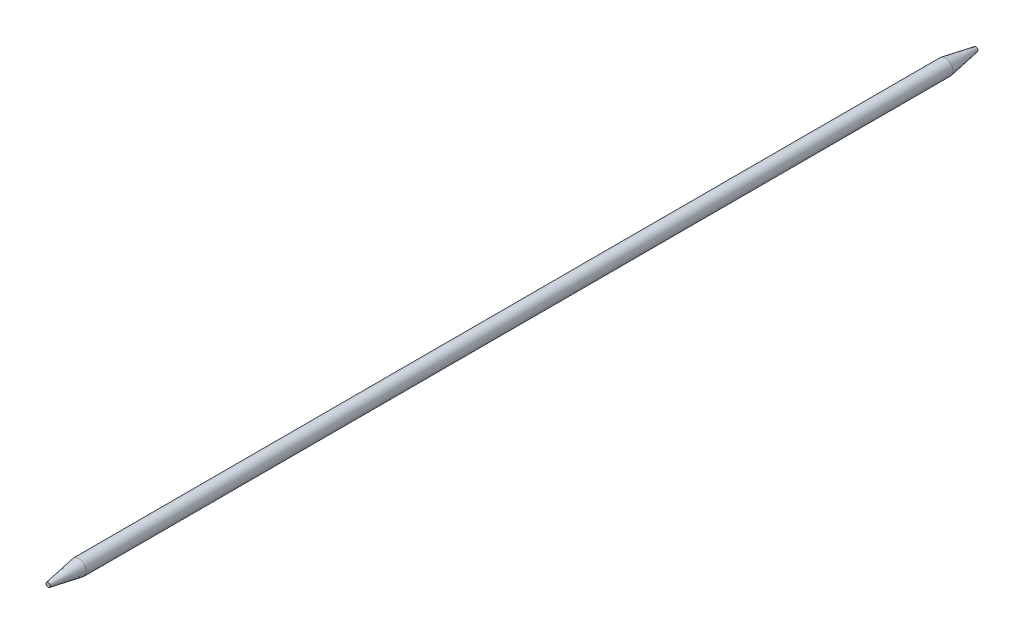
ISO-10303-21;
HEADER;
FILE_DESCRIPTION(('STEP AP214'),'2;1');
FILE_NAME('part.step','',(''),(''),'','','');
FILE_SCHEMA(('AUTOMOTIVE_DESIGN { 1 0 10303 214 1 1 1 1 }'));
ENDSEC;
DATA;
#1=APPLICATION_CONTEXT('core data for automotive mechanical design processes');
#2=APPLICATION_PROTOCOL_DEFINITION('international standard','automotive_design',2000,#1);
#3=PRODUCT_CONTEXT('',#1,'mechanical');
#4=PRODUCT('Part','Part','',(#3));
#5=PRODUCT_RELATED_PRODUCT_CATEGORY('part','',(#4));
#6=PRODUCT_DEFINITION_FORMATION('','',#4);
#7=PRODUCT_DEFINITION_CONTEXT('part definition',#1,'design');
#8=PRODUCT_DEFINITION('design','',#6,#7);
#9=PRODUCT_DEFINITION_SHAPE('','',#8);
#10=(LENGTH_UNIT() NAMED_UNIT(*) SI_UNIT(.MILLI.,.METRE.));
#11=(NAMED_UNIT(*) PLANE_ANGLE_UNIT() SI_UNIT($,.RADIAN.));
#12=(NAMED_UNIT(*) SI_UNIT($,.STERADIAN.) SOLID_ANGLE_UNIT());
#13=UNCERTAINTY_MEASURE_WITH_UNIT(LENGTH_MEASURE(1.E-05),#10,'distance_accuracy_value','');
#14=(GEOMETRIC_REPRESENTATION_CONTEXT(3) GLOBAL_UNCERTAINTY_ASSIGNED_CONTEXT((#13)) GLOBAL_UNIT_ASSIGNED_CONTEXT((#10,
#11,#12)) REPRESENTATION_CONTEXT('',''));
#15=CARTESIAN_POINT('',(0.,0.,0.));
#16=DIRECTION('',(0.,0.,1.));
#17=DIRECTION('',(1.,0.,0.));
#18=AXIS2_PLACEMENT_3D('',#15,#16,#17);
#19=CARTESIAN_POINT('',(0.,0.,10972.8));
#20=DIRECTION('',(0.,0.,-1.));
#21=DIRECTION('',(-1.,0.,0.));
#22=AXIS2_PLACEMENT_3D('',#19,#20,#21);
#23=CYLINDRICAL_SURFACE('',#22,88.9);
#24=CARTESIAN_POINT('',(0.,0.,10612.6736044543));
#25=DIRECTION('',(0.,0.,1.));
#26=DIRECTION('',(1.,0.,0.));
#27=AXIS2_PLACEMENT_3D('',#24,#25,#26);
#28=CIRCLE('',#27,88.9);
#29=CARTESIAN_POINT('',(-88.9000000000001,0.,10612.6736044543));
#30=VERTEX_POINT('',#29);
#31=EDGE_CURVE('E10',#30,#30,#28,.F.);
#32=ORIENTED_EDGE('',*,*,#31,.T.);
#33=EDGE_LOOP('',(#32));
#34=FACE_BOUND('',#33,.T.);
#35=CARTESIAN_POINT('',(0.,0.,360.126395545738));
#36=DIRECTION('',(0.,0.,1.));
#37=DIRECTION('',(1.,0.,0.));
#38=AXIS2_PLACEMENT_3D('',#35,#36,#37);
#39=CIRCLE('',#38,88.9);
#40=CARTESIAN_POINT('',(88.9,0.,360.126395545738));
#41=VERTEX_POINT('',#40);
#42=EDGE_CURVE('E46',#41,#41,#39,.T.);
#43=ORIENTED_EDGE('',*,*,#42,.T.);
#44=EDGE_LOOP('',(#43));
#45=FACE_BOUND('',#44,.T.);
#46=ADVANCED_FACE('F31',(#34,#45),#23,.T.);
#47=CARTESIAN_POINT('',(0.,0.,10972.8));
#48=DIRECTION('',(0.,0.,1.));
#49=DIRECTION('',(1.,0.,0.));
#50=AXIS2_PLACEMENT_3D('',#47,#48,#49);
#51=PLANE('',#50);
#52=CARTESIAN_POINT('',(0.,0.,10972.8));
#53=DIRECTION('',(0.,0.,1.));
#54=DIRECTION('',(1.,0.,0.));
#55=AXIS2_PLACEMENT_3D('',#52,#53,#54);
#56=CIRCLE('',#55,25.4000000000048);
#57=CARTESIAN_POINT('',(-25.4000000000049,0.,10972.8));
#58=VERTEX_POINT('',#57);
#59=EDGE_CURVE('E38',#58,#58,#56,.T.);
#60=ORIENTED_EDGE('',*,*,#59,.T.);
#61=EDGE_LOOP('',(#60));
#62=FACE_BOUND('',#61,.T.);
#63=ADVANCED_FACE('F62',(#62),#51,.T.);
#64=CARTESIAN_POINT('',(0.,0.,0.));
#65=DIRECTION('',(0.,0.,1.));
#66=DIRECTION('',(1.,0.,0.));
#67=AXIS2_PLACEMENT_3D('',#64,#65,#66);
#68=PLANE('',#67);
#69=CARTESIAN_POINT('',(0.,0.,0.));
#70=DIRECTION('',(0.,0.,1.));
#71=DIRECTION('',(1.,0.,0.));
#72=AXIS2_PLACEMENT_3D('',#69,#70,#71);
#73=CIRCLE('',#72,25.3999999999977);
#74=CARTESIAN_POINT('',(25.3999999999977,0.,0.));
#75=VERTEX_POINT('',#74);
#76=EDGE_CURVE('E42',#75,#75,#73,.F.);
#77=ORIENTED_EDGE('',*,*,#76,.T.);
#78=EDGE_LOOP('',(#77));
#79=FACE_BOUND('',#78,.T.);
#80=ADVANCED_FACE('F55',(#79),#68,.F.);
#81=CARTESIAN_POINT('',(0.,0.,360.126395545738));
#82=DIRECTION('',(0.,0.,1.));
#83=DIRECTION('',(1.,0.,0.));
#84=AXIS2_PLACEMENT_3D('',#81,#82,#83);
#85=CONICAL_SURFACE('',#84,88.9,0.174532925199433);
#86=CARTESIAN_POINT('',(25.3999999999977,0.,0.));
#87=CARTESIAN_POINT('',(26.061458333331,0.,3.75131662026809));
#88=CARTESIAN_POINT('',(26.7229166666644,0.,7.5026332405362));
#89=CARTESIAN_POINT('',(28.0458333333311,0.,15.0052664810724));
#90=CARTESIAN_POINT('',(28.7072916666644,0.,18.7565831013405));
#91=CARTESIAN_POINT('',(30.0302083333312,0.,26.2592163418767));
#92=CARTESIAN_POINT('',(30.6916666666645,0.,30.0105329621448));
#93=CARTESIAN_POINT('',(32.0145833333312,0.,37.513166202681));
#94=CARTESIAN_POINT('',(32.6760416666646,0.,41.2644828229491));
#95=CARTESIAN_POINT('',(33.9989583333313,0.,48.7671160634853));
#96=CARTESIAN_POINT('',(34.6604166666647,0.,52.5184326837534));
#97=CARTESIAN_POINT('',(35.9833333333314,0.,60.0210659242896));
#98=CARTESIAN_POINT('',(36.6447916666647,0.,63.7723825445577));
#99=CARTESIAN_POINT('',(37.9677083333315,0.,71.2750157850939));
#100=CARTESIAN_POINT('',(38.6291666666648,0.,75.026332405362));
#101=CARTESIAN_POINT('',(39.9520833333315,0.,82.5289656458982));
#102=CARTESIAN_POINT('',(40.6135416666649,0.,86.2802822661663));
#103=CARTESIAN_POINT('',(41.9364583333316,0.,93.7829155067025));
#104=CARTESIAN_POINT('',(42.597916666665,0.,97.5342321269706));
#105=CARTESIAN_POINT('',(43.9208333333317,0.,105.036865367507));
#106=CARTESIAN_POINT('',(44.582291666665,0.,108.788181987775));
#107=CARTESIAN_POINT('',(45.9052083333317,0.,116.290815228311));
#108=CARTESIAN_POINT('',(46.5666666666651,0.,120.042131848579));
#109=CARTESIAN_POINT('',(47.8895833333318,0.,127.544765089115));
#110=CARTESIAN_POINT('',(48.5510416666652,0.,131.296081709384));
#111=CARTESIAN_POINT('',(49.8739583333319,0.,138.79871494992));
#112=CARTESIAN_POINT('',(50.5354166666652,0.,142.550031570188));
#113=CARTESIAN_POINT('',(51.858333333332,0.,150.052664810724));
#114=CARTESIAN_POINT('',(52.5197916666653,0.,153.803981430992));
#115=CARTESIAN_POINT('',(53.842708333332,0.,161.306614671528));
#116=CARTESIAN_POINT('',(54.5041666666654,0.,165.057931291796));
#117=CARTESIAN_POINT('',(55.8270833333321,0.,172.560564532333));
#118=CARTESIAN_POINT('',(56.4885416666655,0.,176.311881152601));
#119=CARTESIAN_POINT('',(57.8114583333322,0.,183.814514393137));
#120=CARTESIAN_POINT('',(58.4729166666655,0.,187.565831013405));
#121=CARTESIAN_POINT('',(59.7958333333323,0.,195.068464253941));
#122=CARTESIAN_POINT('',(60.4572916666656,0.,198.819780874209));
#123=CARTESIAN_POINT('',(61.7802083333323,0.,206.322414114746));
#124=CARTESIAN_POINT('',(62.4416666666657,0.,210.073730735014));
#125=CARTESIAN_POINT('',(63.7645833333324,0.,217.57636397555));
#126=CARTESIAN_POINT('',(64.4260416666658,0.,221.327680595818));
#127=CARTESIAN_POINT('',(65.7489583333325,0.,228.830313836354));
#128=CARTESIAN_POINT('',(66.4104166666658,0.,232.581630456622));
#129=CARTESIAN_POINT('',(67.7333333333326,0.,240.084263697158));
#130=CARTESIAN_POINT('',(68.3947916666659,0.,243.835580317427));
#131=CARTESIAN_POINT('',(69.7177083333326,0.,251.338213557963));
#132=CARTESIAN_POINT('',(70.379166666666,0.,255.089530178231));
#133=CARTESIAN_POINT('',(71.7020833333327,0.,262.592163418767));
#134=CARTESIAN_POINT('',(72.3635416666661,0.,266.343480039035));
#135=CARTESIAN_POINT('',(73.6864583333328,0.,273.846113279571));
#136=CARTESIAN_POINT('',(74.3479166666661,0.,277.597429899839));
#137=CARTESIAN_POINT('',(75.6708333333328,0.,285.100063140376));
#138=CARTESIAN_POINT('',(76.3322916666662,0.,288.851379760644));
#139=CARTESIAN_POINT('',(77.6552083333329,0.,296.35401300118));
#140=CARTESIAN_POINT('',(78.3166666666663,0.,300.105329621448));
#141=CARTESIAN_POINT('',(79.639583333333,0.,307.607962861984));
#142=CARTESIAN_POINT('',(80.3010416666663,0.,311.359279482252));
#143=CARTESIAN_POINT('',(81.6239583333331,0.,318.861912722789));
#144=CARTESIAN_POINT('',(82.2854166666664,0.,322.613229343057));
#145=CARTESIAN_POINT('',(83.6083333333331,0.,330.115862583593));
#146=CARTESIAN_POINT('',(84.2697916666665,0.,333.867179203861));
#147=CARTESIAN_POINT('',(85.5927083333332,0.,341.369812444397));
#148=CARTESIAN_POINT('',(86.2541666666666,0.,345.121129064665));
#149=CARTESIAN_POINT('',(87.5770833333333,0.,352.623762305201));
#150=CARTESIAN_POINT('',(88.2385416666666,0.,356.37507892547));
#151=CARTESIAN_POINT('',(88.9,0.,360.126395545738));
#152=B_SPLINE_CURVE_WITH_KNOTS('',3,(#86,#87,#88,#89,#90,#91,#92,#93,#94,#95,#96,#97,#98,#99,
#100,#101,#102,#103,#104,#105,#106,#107,#108,#109,#110,#111,#112,#113,#114,#115,#116,#117,#118,
#119,#120,#121,#122,#123,#124,#125,#126,#127,#128,#129,#130,#131,#132,#133,#134,#135,#136,#137,
#138,#139,#140,#141,#142,#143,#144,#145,#146,#147,#148,#149,#150,#151),.UNSPECIFIED.,.F.,.F.,(4,
2,2,2,2,2,2,2,2,2,2,2,2,2,2,2,2,2,2,2,2,2,2,2,2,2,2,2,2,2,2,2,4),(0.,11.4275601774886,
22.8551203549771,34.2826805324657,45.7102407099543,57.1378008874428,68.5653610649314,
79.99292124242,91.4204814199085,102.848041597397,114.275601774886,125.703161952374,
137.130722129863,148.558282307351,159.98584248484,171.413402662328,182.840962839817,
194.268523017306,205.696083194794,217.123643372283,228.551203549771,239.97876372726,
251.406323904748,262.833884082237,274.261444259725,285.689004437214,297.116564614703,
308.544124792191,319.97168496968,331.399245147168,342.826805324657,354.254365502146,
365.681925679634),.UNSPECIFIED.);
#153=EDGE_CURVE('BSEAM53',#75,#41,#152,.T.);
#154=ORIENTED_EDGE('',*,*,#76,.F.);
#155=ORIENTED_EDGE('',*,*,#42,.F.);
#156=ORIENTED_EDGE('',*,*,#153,.T.);
#157=ORIENTED_EDGE('',*,*,#153,.F.);
#158=EDGE_LOOP('',(#154,#156,#155,#157));
#159=FACE_BOUND('',#158,.T.);
#160=ADVANCED_FACE('F53',(#159),#85,.T.);
#161=CARTESIAN_POINT('',(0.,0.,10972.8));
#162=DIRECTION('',(0.,0.,-1.));
#163=DIRECTION('',(-1.,0.,0.));
#164=AXIS2_PLACEMENT_3D('',#161,#162,#163);
#165=CONICAL_SURFACE('',#164,25.4000000000048,0.17453292519943);
#166=CARTESIAN_POINT('',(-88.9000000000001,0.,10612.6736044543));
#167=CARTESIAN_POINT('',(-88.2385416666669,0.,10616.4249210746));
#168=CARTESIAN_POINT('',(-87.5770833333336,0.,10620.1762376948));
#169=CARTESIAN_POINT('',(-86.254166666667,0.,10627.6788709354));
#170=CARTESIAN_POINT('',(-85.5927083333337,0.,10631.4301875556));
#171=CARTESIAN_POINT('',(-84.2697916666672,0.,10638.9328207962));
#172=CARTESIAN_POINT('',(-83.6083333333339,0.,10642.6841374164));
#173=CARTESIAN_POINT('',(-82.2854166666673,0.,10650.186770657));
#174=CARTESIAN_POINT('',(-81.623958333334,0.,10653.9380872772));
#175=CARTESIAN_POINT('',(-80.3010416666675,0.,10661.4407205178));
#176=CARTESIAN_POINT('',(-79.6395833333342,0.,10665.192037138));
#177=CARTESIAN_POINT('',(-78.3166666666676,0.,10672.6946703786));
#178=CARTESIAN_POINT('',(-77.6552083333343,0.,10676.4459869988));
#179=CARTESIAN_POINT('',(-76.3322916666678,0.,10683.9486202394));
#180=CARTESIAN_POINT('',(-75.6708333333345,0.,10687.6999368596));
#181=CARTESIAN_POINT('',(-74.3479166666679,0.,10695.2025701002));
#182=CARTESIAN_POINT('',(-73.6864583333346,0.,10698.9538867205));
#183=CARTESIAN_POINT('',(-72.3635416666681,0.,10706.456519961));
#184=CARTESIAN_POINT('',(-71.7020833333348,0.,10710.2078365813));
#185=CARTESIAN_POINT('',(-70.3791666666682,0.,10717.7104698218));
#186=CARTESIAN_POINT('',(-69.7177083333349,0.,10721.4617864421));
#187=CARTESIAN_POINT('',(-68.3947916666684,0.,10728.9644196826));
#188=CARTESIAN_POINT('',(-67.7333333333351,0.,10732.7157363029));
#189=CARTESIAN_POINT('',(-66.4104166666685,0.,10740.2183695434));
#190=CARTESIAN_POINT('',(-65.7489583333352,0.,10743.9696861637));
#191=CARTESIAN_POINT('',(-64.4260416666687,0.,10751.4723194042));
#192=CARTESIAN_POINT('',(-63.7645833333354,0.,10755.2236360245));
#193=CARTESIAN_POINT('',(-62.4416666666688,0.,10762.726269265));
#194=CARTESIAN_POINT('',(-61.7802083333355,0.,10766.4775858853));
#195=CARTESIAN_POINT('',(-60.4572916666689,0.,10773.9802191258));
#196=CARTESIAN_POINT('',(-59.7958333333357,0.,10777.7315357461));
#197=CARTESIAN_POINT('',(-58.4729166666691,0.,10785.2341689866));
#198=CARTESIAN_POINT('',(-57.8114583333358,0.,10788.9854856069));
#199=CARTESIAN_POINT('',(-56.4885416666692,0.,10796.4881188474));
#200=CARTESIAN_POINT('',(-55.827083333336,0.,10800.2394354677));
#201=CARTESIAN_POINT('',(-54.5041666666694,0.,10807.7420687082));
#202=CARTESIAN_POINT('',(-53.8427083333361,0.,10811.4933853285));
#203=CARTESIAN_POINT('',(-52.5197916666695,0.,10818.996018569));
#204=CARTESIAN_POINT('',(-51.8583333333363,0.,10822.7473351893));
#205=CARTESIAN_POINT('',(-50.5354166666697,0.,10830.2499684298));
#206=CARTESIAN_POINT('',(-49.8739583333364,0.,10834.0012850501));
#207=CARTESIAN_POINT('',(-48.5510416666698,0.,10841.5039182906));
#208=CARTESIAN_POINT('',(-47.8895833333366,0.,10845.2552349109));
#209=CARTESIAN_POINT('',(-46.56666666667,0.,10852.7578681514));
#210=CARTESIAN_POINT('',(-45.9052083333367,0.,10856.5091847717));
#211=CARTESIAN_POINT('',(-44.5822916666701,0.,10864.0118180122));
#212=CARTESIAN_POINT('',(-43.9208333333369,0.,10867.7631346325));
#213=CARTESIAN_POINT('',(-42.5979166666703,0.,10875.265767873));
#214=CARTESIAN_POINT('',(-41.936458333337,0.,10879.0170844933));
#215=CARTESIAN_POINT('',(-40.6135416666704,0.,10886.5197177338));
#216=CARTESIAN_POINT('',(-39.9520833333371,0.,10890.2710343541));
#217=CARTESIAN_POINT('',(-38.6291666666706,0.,10897.7736675946));
#218=CARTESIAN_POINT('',(-37.9677083333373,0.,10901.5249842149));
#219=CARTESIAN_POINT('',(-36.6447916666707,0.,10909.0276174554));
#220=CARTESIAN_POINT('',(-35.9833333333374,0.,10912.7789340757));
#221=CARTESIAN_POINT('',(-34.6604166666709,0.,10920.2815673162));
#222=CARTESIAN_POINT('',(-33.9989583333376,0.,10924.0328839365));
#223=CARTESIAN_POINT('',(-32.676041666671,0.,10931.5355171771));
#224=CARTESIAN_POINT('',(-32.0145833333377,0.,10935.2868337973));
#225=CARTESIAN_POINT('',(-30.6916666666712,0.,10942.7894670379));
#226=CARTESIAN_POINT('',(-30.0302083333379,0.,10946.5407836581));
#227=CARTESIAN_POINT('',(-28.7072916666713,0.,10954.0434168987));
#228=CARTESIAN_POINT('',(-28.045833333338,0.,10957.7947335189));
#229=CARTESIAN_POINT('',(-26.7229166666715,0.,10965.2973667595));
#230=CARTESIAN_POINT('',(-26.0614583333382,0.,10969.0486833797));
#231=CARTESIAN_POINT('',(-25.4000000000049,0.,10972.8));
#232=B_SPLINE_CURVE_WITH_KNOTS('',3,(#166,#167,#168,#169,#170,#171,#172,#173,#174,#175,#176,
#177,#178,#179,#180,#181,#182,#183,#184,#185,#186,#187,#188,#189,#190,#191,#192,#193,#194,#195,
#196,#197,#198,#199,#200,#201,#202,#203,#204,#205,#206,#207,#208,#209,#210,#211,#212,#213,#214,
#215,#216,#217,#218,#219,#220,#221,#222,#223,#224,#225,#226,#227,#228,#229,#230,#231),
.UNSPECIFIED.,.F.,.F.,(4,2,2,2,2,2,2,2,2,2,2,2,2,2,2,2,2,2,2,2,2,2,2,2,2,2,2,2,2,2,2,2,4),(0.,
11.4275601774875,22.8551203549751,34.2826805324626,45.7102407099502,57.1378008874377,
68.5653610649253,79.9929212424128,91.4204814199003,102.848041597388,114.275601774875,
125.703161952363,137.130722129851,148.558282307338,159.985842484826,171.413402662313,
182.840962839801,194.268523017288,205.696083194776,217.123643372263,228.551203549751,
239.978763727238,251.406323904726,262.833884082213,274.261444259701,285.689004437188,
297.116564614676,308.544124792163,319.971684969651,331.399245147138,342.826805324626,
354.254365502114,365.681925679601),.UNSPECIFIED.);
#233=EDGE_CURVE('BSEAM33',#30,#58,#232,.T.);
#234=ORIENTED_EDGE('',*,*,#31,.F.);
#235=ORIENTED_EDGE('',*,*,#59,.F.);
#236=ORIENTED_EDGE('',*,*,#233,.T.);
#237=ORIENTED_EDGE('',*,*,#233,.F.);
#238=EDGE_LOOP('',(#234,#236,#235,#237));
#239=FACE_BOUND('',#238,.T.);
#240=ADVANCED_FACE('F33',(#239),#165,.T.);
#241=CLOSED_SHELL('',(#46,#63,#80,#160,#240));
#242=MANIFOLD_SOLID_BREP('B2',#241);
#243=ADVANCED_BREP_SHAPE_REPRESENTATION('',(#18,#242),#14);
#244=SHAPE_DEFINITION_REPRESENTATION(#9,#243);
ENDSEC;
END-ISO-10303-21;
